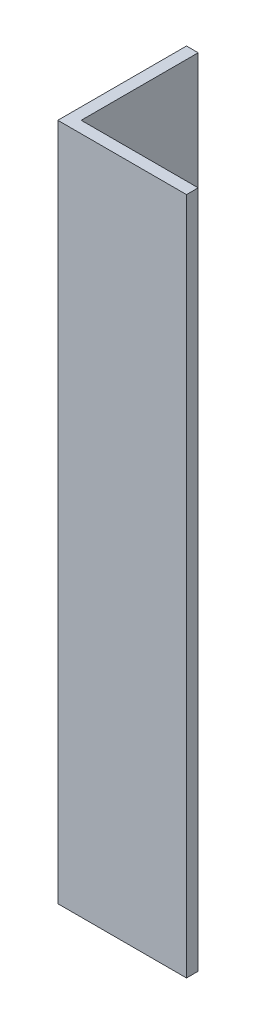
ISO-10303-21;
HEADER;
FILE_DESCRIPTION(('STEP AP214'),'2;1');
FILE_NAME('part.step','',(''),(''),'','','');
FILE_SCHEMA(('AUTOMOTIVE_DESIGN { 1 0 10303 214 1 1 1 1 }'));
ENDSEC;
DATA;
#1=APPLICATION_CONTEXT('core data for automotive mechanical design processes');
#2=APPLICATION_PROTOCOL_DEFINITION('international standard','automotive_design',2000,#1);
#3=PRODUCT_CONTEXT('',#1,'mechanical');
#4=PRODUCT('Part','Part','',(#3));
#5=PRODUCT_RELATED_PRODUCT_CATEGORY('part','',(#4));
#6=PRODUCT_DEFINITION_FORMATION('','',#4);
#7=PRODUCT_DEFINITION_CONTEXT('part definition',#1,'design');
#8=PRODUCT_DEFINITION('design','',#6,#7);
#9=PRODUCT_DEFINITION_SHAPE('','',#8);
#10=(LENGTH_UNIT() NAMED_UNIT(*) SI_UNIT(.MILLI.,.METRE.));
#11=(NAMED_UNIT(*) PLANE_ANGLE_UNIT() SI_UNIT($,.RADIAN.));
#12=(NAMED_UNIT(*) SI_UNIT($,.STERADIAN.) SOLID_ANGLE_UNIT());
#13=UNCERTAINTY_MEASURE_WITH_UNIT(LENGTH_MEASURE(1.E-05),#10,'distance_accuracy_value','');
#14=(GEOMETRIC_REPRESENTATION_CONTEXT(3) GLOBAL_UNCERTAINTY_ASSIGNED_CONTEXT((#13)) GLOBAL_UNIT_ASSIGNED_CONTEXT((#10,
#11,#12)) REPRESENTATION_CONTEXT('',''));
#15=CARTESIAN_POINT('',(0.,0.,0.));
#16=DIRECTION('',(0.,0.,1.));
#17=DIRECTION('',(1.,0.,0.));
#18=AXIS2_PLACEMENT_3D('',#15,#16,#17);
#19=CARTESIAN_POINT('',(-2.,116.,1.07187339486148));
#20=DIRECTION('',(0.,0.,1.));
#21=DIRECTION('',(1.,0.,0.));
#22=AXIS2_PLACEMENT_3D('',#19,#20,#21);
#23=PLANE('',#22);
#24=DIRECTION('',(-1.,0.,0.));
#25=VECTOR('',#24,1.);
#26=CARTESIAN_POINT('',(-2.,0.,1.07187339486148));
#27=LINE('',#26,#25);
#28=CARTESIAN_POINT('',(0.,0.,1.07187339486148));
#29=VERTEX_POINT('',#28);
#30=CARTESIAN_POINT('',(-2.,0.,1.07187339486148));
#31=VERTEX_POINT('',#30);
#32=EDGE_CURVE('E115',#29,#31,#27,.T.);
#33=ORIENTED_EDGE('',*,*,#32,.T.);
#34=DIRECTION('',(0.,-1.,0.));
#35=VECTOR('',#34,1.);
#36=CARTESIAN_POINT('',(-2.,116.,1.07187339486148));
#37=LINE('',#36,#35);
#38=CARTESIAN_POINT('',(-2.,116.,1.07187339486148));
#39=VERTEX_POINT('',#38);
#40=EDGE_CURVE('E11',#39,#31,#37,.T.);
#41=ORIENTED_EDGE('',*,*,#40,.F.);
#42=DIRECTION('',(-1.,0.,0.));
#43=VECTOR('',#42,1.);
#44=CARTESIAN_POINT('',(-2.,116.,1.07187339486148));
#45=LINE('',#44,#43);
#46=CARTESIAN_POINT('',(0.,116.,1.07187339486148));
#47=VERTEX_POINT('',#46);
#48=EDGE_CURVE('E125',#47,#39,#45,.T.);
#49=ORIENTED_EDGE('',*,*,#48,.F.);
#50=DIRECTION('',(0.,-1.,0.));
#51=VECTOR('',#50,1.);
#52=CARTESIAN_POINT('',(0.,116.,1.07187339486148));
#53=LINE('',#52,#51);
#54=EDGE_CURVE('E111',#47,#29,#53,.T.);
#55=ORIENTED_EDGE('',*,*,#54,.T.);
#56=EDGE_LOOP('',(#33,#41,#49,#55));
#57=FACE_BOUND('',#56,.T.);
#58=ADVANCED_FACE('F31',(#57),#23,.F.);
#59=CARTESIAN_POINT('',(-2.,116.,23.0718733948615));
#60=DIRECTION('',(1.,0.,0.));
#61=DIRECTION('',(0.,0.,-1.));
#62=AXIS2_PLACEMENT_3D('',#59,#60,#61);
#63=PLANE('',#62);
#64=DIRECTION('',(0.,0.,1.));
#65=VECTOR('',#64,1.);
#66=CARTESIAN_POINT('',(-2.,0.,23.0718733948615));
#67=LINE('',#66,#65);
#68=CARTESIAN_POINT('',(-2.,0.,23.0718733948615));
#69=VERTEX_POINT('',#68);
#70=EDGE_CURVE('E118',#31,#69,#67,.T.);
#71=ORIENTED_EDGE('',*,*,#70,.T.);
#72=DIRECTION('',(0.,-1.,0.));
#73=VECTOR('',#72,1.);
#74=CARTESIAN_POINT('',(-2.,116.,23.0718733948615));
#75=LINE('',#74,#73);
#76=CARTESIAN_POINT('',(-2.,116.,23.0718733948615));
#77=VERTEX_POINT('',#76);
#78=EDGE_CURVE('E39',#77,#69,#75,.T.);
#79=ORIENTED_EDGE('',*,*,#78,.F.);
#80=DIRECTION('',(0.,0.,1.));
#81=VECTOR('',#80,1.);
#82=CARTESIAN_POINT('',(-2.,116.,23.0718733948615));
#83=LINE('',#82,#81);
#84=EDGE_CURVE('E84',#39,#77,#83,.T.);
#85=ORIENTED_EDGE('',*,*,#84,.F.);
#86=ORIENTED_EDGE('',*,*,#40,.T.);
#87=EDGE_LOOP('',(#71,#79,#85,#86));
#88=FACE_BOUND('',#87,.T.);
#89=ADVANCED_FACE('F149',(#88),#63,.F.);
#90=CARTESIAN_POINT('',(20.,116.,23.0718733948615));
#91=DIRECTION('',(0.,0.,-1.));
#92=DIRECTION('',(-1.,0.,0.));
#93=AXIS2_PLACEMENT_3D('',#90,#91,#92);
#94=PLANE('',#93);
#95=DIRECTION('',(1.,0.,0.));
#96=VECTOR('',#95,1.);
#97=CARTESIAN_POINT('',(20.,0.,23.0718733948615));
#98=LINE('',#97,#96);
#99=CARTESIAN_POINT('',(20.,0.,23.0718733948615));
#100=VERTEX_POINT('',#99);
#101=EDGE_CURVE('E120',#69,#100,#98,.T.);
#102=ORIENTED_EDGE('',*,*,#101,.T.);
#103=DIRECTION('',(0.,-1.,0.));
#104=VECTOR('',#103,1.);
#105=CARTESIAN_POINT('',(20.,116.,23.0718733948615));
#106=LINE('',#105,#104);
#107=CARTESIAN_POINT('',(20.,116.,23.0718733948615));
#108=VERTEX_POINT('',#107);
#109=EDGE_CURVE('E106',#108,#100,#106,.T.);
#110=ORIENTED_EDGE('',*,*,#109,.F.);
#111=DIRECTION('',(1.,0.,0.));
#112=VECTOR('',#111,1.);
#113=CARTESIAN_POINT('',(20.,116.,23.0718733948615));
#114=LINE('',#113,#112);
#115=EDGE_CURVE('E97',#77,#108,#114,.T.);
#116=ORIENTED_EDGE('',*,*,#115,.F.);
#117=ORIENTED_EDGE('',*,*,#78,.T.);
#118=EDGE_LOOP('',(#102,#110,#116,#117));
#119=FACE_BOUND('',#118,.T.);
#120=ADVANCED_FACE('F131',(#119),#94,.F.);
#121=CARTESIAN_POINT('',(20.,116.,21.0718733948615));
#122=DIRECTION('',(-1.,0.,0.));
#123=DIRECTION('',(0.,0.,1.));
#124=AXIS2_PLACEMENT_3D('',#121,#122,#123);
#125=PLANE('',#124);
#126=DIRECTION('',(0.,0.,-1.));
#127=VECTOR('',#126,1.);
#128=CARTESIAN_POINT('',(20.,0.,21.0718733948615));
#129=LINE('',#128,#127);
#130=CARTESIAN_POINT('',(20.,0.,21.0718733948615));
#131=VERTEX_POINT('',#130);
#132=EDGE_CURVE('E105',#100,#131,#129,.T.);
#133=ORIENTED_EDGE('',*,*,#132,.T.);
#134=DIRECTION('',(0.,-1.,0.));
#135=VECTOR('',#134,1.);
#136=CARTESIAN_POINT('',(20.,116.,21.0718733948615));
#137=LINE('',#136,#135);
#138=CARTESIAN_POINT('',(20.,116.,21.0718733948615));
#139=VERTEX_POINT('',#138);
#140=EDGE_CURVE('E102',#139,#131,#137,.T.);
#141=ORIENTED_EDGE('',*,*,#140,.F.);
#142=DIRECTION('',(0.,0.,-1.));
#143=VECTOR('',#142,1.);
#144=CARTESIAN_POINT('',(20.,116.,21.0718733948615));
#145=LINE('',#144,#143);
#146=EDGE_CURVE('E91',#108,#139,#145,.T.);
#147=ORIENTED_EDGE('',*,*,#146,.F.);
#148=ORIENTED_EDGE('',*,*,#109,.T.);
#149=EDGE_LOOP('',(#133,#141,#147,#148));
#150=FACE_BOUND('',#149,.T.);
#151=ADVANCED_FACE('F103',(#150),#125,.F.);
#152=CARTESIAN_POINT('',(0.,116.,21.0718733948615));
#153=DIRECTION('',(0.,0.,1.));
#154=DIRECTION('',(1.,0.,0.));
#155=AXIS2_PLACEMENT_3D('',#152,#153,#154);
#156=PLANE('',#155);
#157=DIRECTION('',(-1.,0.,0.));
#158=VECTOR('',#157,1.);
#159=CARTESIAN_POINT('',(0.,0.,21.0718733948615));
#160=LINE('',#159,#158);
#161=CARTESIAN_POINT('',(0.,0.,21.0718733948615));
#162=VERTEX_POINT('',#161);
#163=EDGE_CURVE('E70',#131,#162,#160,.T.);
#164=ORIENTED_EDGE('',*,*,#163,.T.);
#165=DIRECTION('',(0.,-1.,0.));
#166=VECTOR('',#165,1.);
#167=CARTESIAN_POINT('',(0.,116.,21.0718733948615));
#168=LINE('',#167,#166);
#169=CARTESIAN_POINT('',(0.,116.,21.0718733948615));
#170=VERTEX_POINT('',#169);
#171=EDGE_CURVE('E107',#170,#162,#168,.T.);
#172=ORIENTED_EDGE('',*,*,#171,.F.);
#173=DIRECTION('',(-1.,0.,0.));
#174=VECTOR('',#173,1.);
#175=CARTESIAN_POINT('',(0.,116.,21.0718733948615));
#176=LINE('',#175,#174);
#177=EDGE_CURVE('E95',#139,#170,#176,.T.);
#178=ORIENTED_EDGE('',*,*,#177,.F.);
#179=ORIENTED_EDGE('',*,*,#140,.T.);
#180=EDGE_LOOP('',(#164,#172,#178,#179));
#181=FACE_BOUND('',#180,.T.);
#182=ADVANCED_FACE('F109',(#181),#156,.F.);
#183=CARTESIAN_POINT('',(0.,116.,1.07187339486148));
#184=DIRECTION('',(-1.,0.,0.));
#185=DIRECTION('',(0.,0.,1.));
#186=AXIS2_PLACEMENT_3D('',#183,#184,#185);
#187=PLANE('',#186);
#188=DIRECTION('',(0.,0.,-1.));
#189=VECTOR('',#188,1.);
#190=CARTESIAN_POINT('',(0.,0.,1.07187339486148));
#191=LINE('',#190,#189);
#192=EDGE_CURVE('E76',#162,#29,#191,.T.);
#193=ORIENTED_EDGE('',*,*,#192,.T.);
#194=ORIENTED_EDGE('',*,*,#54,.F.);
#195=DIRECTION('',(0.,0.,-1.));
#196=VECTOR('',#195,1.);
#197=CARTESIAN_POINT('',(0.,116.,1.07187339486148));
#198=LINE('',#197,#196);
#199=EDGE_CURVE('E47',#170,#47,#198,.T.);
#200=ORIENTED_EDGE('',*,*,#199,.F.);
#201=ORIENTED_EDGE('',*,*,#171,.T.);
#202=EDGE_LOOP('',(#193,#194,#200,#201));
#203=FACE_BOUND('',#202,.T.);
#204=ADVANCED_FACE('F138',(#203),#187,.F.);
#205=CARTESIAN_POINT('',(0.,116.,1.07187339486148));
#206=DIRECTION('',(0.,-1.,0.));
#207=DIRECTION('',(0.,0.,-1.));
#208=AXIS2_PLACEMENT_3D('',#205,#206,#207);
#209=PLANE('',#208);
#210=ORIENTED_EDGE('',*,*,#48,.T.);
#211=ORIENTED_EDGE('',*,*,#84,.T.);
#212=ORIENTED_EDGE('',*,*,#115,.T.);
#213=ORIENTED_EDGE('',*,*,#146,.T.);
#214=ORIENTED_EDGE('',*,*,#177,.T.);
#215=ORIENTED_EDGE('',*,*,#199,.T.);
#216=EDGE_LOOP('',(#210,#211,#212,#213,#214,#215));
#217=FACE_BOUND('',#216,.T.);
#218=ADVANCED_FACE('F93',(#217),#209,.F.);
#219=CARTESIAN_POINT('',(0.,0.,1.07187339486148));
#220=DIRECTION('',(0.,-1.,0.));
#221=DIRECTION('',(0.,0.,-1.));
#222=AXIS2_PLACEMENT_3D('',#219,#220,#221);
#223=PLANE('',#222);
#224=ORIENTED_EDGE('',*,*,#32,.F.);
#225=ORIENTED_EDGE('',*,*,#192,.F.);
#226=ORIENTED_EDGE('',*,*,#163,.F.);
#227=ORIENTED_EDGE('',*,*,#132,.F.);
#228=ORIENTED_EDGE('',*,*,#101,.F.);
#229=ORIENTED_EDGE('',*,*,#70,.F.);
#230=EDGE_LOOP('',(#224,#225,#226,#227,#228,#229));
#231=FACE_BOUND('',#230,.T.);
#232=ADVANCED_FACE('F134',(#231),#223,.T.);
#233=CLOSED_SHELL('',(#58,#89,#120,#151,#182,#204,#218,#232));
#234=MANIFOLD_SOLID_BREP('B2',#233);
#235=ADVANCED_BREP_SHAPE_REPRESENTATION('',(#18,#234),#14);
#236=SHAPE_DEFINITION_REPRESENTATION(#9,#235);
ENDSEC;
END-ISO-10303-21;
